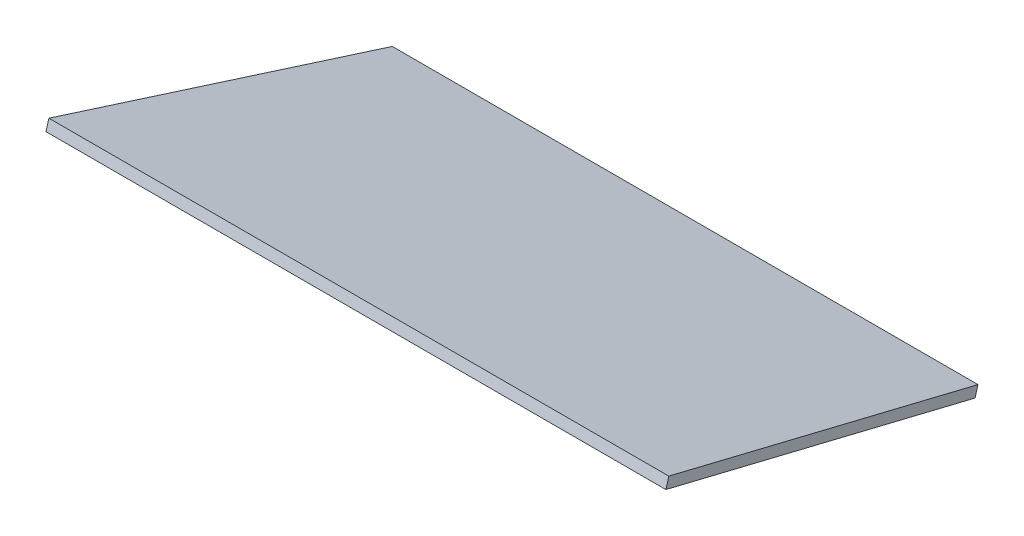
ISO-10303-21;
HEADER;
FILE_DESCRIPTION(('STEP AP214'),'2;1');
FILE_NAME('part.step','',(''),(''),'','','');
FILE_SCHEMA(('AUTOMOTIVE_DESIGN { 1 0 10303 214 1 1 1 1 }'));
ENDSEC;
DATA;
#1=APPLICATION_CONTEXT('core data for automotive mechanical design processes');
#2=APPLICATION_PROTOCOL_DEFINITION('international standard','automotive_design',2000,#1);
#3=PRODUCT_CONTEXT('',#1,'mechanical');
#4=PRODUCT('Part','Part','',(#3));
#5=PRODUCT_RELATED_PRODUCT_CATEGORY('part','',(#4));
#6=PRODUCT_DEFINITION_FORMATION('','',#4);
#7=PRODUCT_DEFINITION_CONTEXT('part definition',#1,'design');
#8=PRODUCT_DEFINITION('design','',#6,#7);
#9=PRODUCT_DEFINITION_SHAPE('','',#8);
#10=(LENGTH_UNIT() NAMED_UNIT(*) SI_UNIT(.MILLI.,.METRE.));
#11=(NAMED_UNIT(*) PLANE_ANGLE_UNIT() SI_UNIT($,.RADIAN.));
#12=(NAMED_UNIT(*) SI_UNIT($,.STERADIAN.) SOLID_ANGLE_UNIT());
#13=UNCERTAINTY_MEASURE_WITH_UNIT(LENGTH_MEASURE(1.E-05),#10,'distance_accuracy_value','');
#14=(GEOMETRIC_REPRESENTATION_CONTEXT(3) GLOBAL_UNCERTAINTY_ASSIGNED_CONTEXT((#13)) GLOBAL_UNIT_ASSIGNED_CONTEXT((#10,
#11,#12)) REPRESENTATION_CONTEXT('',''));
#15=CARTESIAN_POINT('',(0.,0.,0.));
#16=DIRECTION('',(0.,0.,1.));
#17=DIRECTION('',(1.,0.,0.));
#18=AXIS2_PLACEMENT_3D('',#15,#16,#17);
#19=CARTESIAN_POINT('',(-973.596176485732,862.556716449971,-601.47648078467));
#20=DIRECTION('',(0.,0.962139084786726,-0.272558950551549));
#21=DIRECTION('',(0.,0.272558950551549,0.962139084786726));
#22=AXIS2_PLACEMENT_3D('',#19,#20,#21);
#23=PLANE('',#22);
#24=DIRECTION('',(1.,0.,0.));
#25=VECTOR('',#24,1.);
#26=CARTESIAN_POINT('',(-973.596176485732,862.556716449971,-601.47648078467));
#27=LINE('',#26,#25);
#28=CARTESIAN_POINT('',(-440.977953351101,862.556716449971,-601.47648078467));
#29=VERTEX_POINT('',#28);
#30=CARTESIAN_POINT('',(440.977953351101,862.556716449971,-601.47648078467));
#31=VERTEX_POINT('',#30);
#32=EDGE_CURVE('E11',#29,#31,#27,.T.);
#33=ORIENTED_EDGE('',*,*,#32,.F.);
#34=DIRECTION('',(0.0503595928807039,-0.272213114321527,-0.960918275295181));
#35=VECTOR('',#34,1.);
#36=CARTESIAN_POINT('',(-442.328720352341,869.858135526198,-575.702311000741));
#37=LINE('',#36,#35);
#38=CARTESIAN_POINT('',(-466.729350119314,1001.75299488316,-110.110559150412));
#39=VERTEX_POINT('',#38);
#40=EDGE_CURVE('E90',#39,#29,#37,.T.);
#41=ORIENTED_EDGE('',*,*,#40,.F.);
#42=DIRECTION('',(1.,0.,0.));
#43=VECTOR('',#42,1.);
#44=CARTESIAN_POINT('',(-973.596176485732,1001.75299488316,-110.110559150412));
#45=LINE('',#44,#43);
#46=CARTESIAN_POINT('',(466.729350119314,1001.75299488316,-110.110559150412));
#47=VERTEX_POINT('',#46);
#48=EDGE_CURVE('E40',#39,#47,#45,.T.);
#49=ORIENTED_EDGE('',*,*,#48,.T.);
#50=DIRECTION('',(-0.0503595928807039,-0.272213114321527,-0.960918275295181));
#51=VECTOR('',#50,1.);
#52=CARTESIAN_POINT('',(442.328720352341,869.858135526198,-575.702311000741));
#53=LINE('',#52,#51);
#54=EDGE_CURVE('E89',#47,#31,#53,.T.);
#55=ORIENTED_EDGE('',*,*,#54,.T.);
#56=EDGE_LOOP('',(#33,#41,#49,#55));
#57=FACE_BOUND('',#56,.T.);
#58=ADVANCED_FACE('F37',(#57),#23,.T.);
#59=CARTESIAN_POINT('',(-973.596176485732,862.556716449971,-601.47648078467));
#60=DIRECTION('',(0.,0.272558950551546,0.962139084786727));
#61=DIRECTION('',(0.,-0.962139084786727,0.272558950551546));
#62=AXIS2_PLACEMENT_3D('',#59,#60,#61);
#63=PLANE('',#62);
#64=DIRECTION('',(0.,0.962139084786726,-0.272558950551549));
#65=VECTOR('',#64,1.);
#66=CARTESIAN_POINT('',(-440.977953351101,862.556716449971,-601.47648078467));
#67=LINE('',#66,#65);
#68=CARTESIAN_POINT('',(-440.977953351101,847.162491093384,-597.115537575845));
#69=VERTEX_POINT('',#68);
#70=EDGE_CURVE('E59',#29,#69,#67,.F.);
#71=ORIENTED_EDGE('',*,*,#70,.F.);
#72=ORIENTED_EDGE('',*,*,#32,.T.);
#73=DIRECTION('',(0.,0.962139084786726,-0.272558950551549));
#74=VECTOR('',#73,1.);
#75=CARTESIAN_POINT('',(440.977953351101,862.556716449971,-601.47648078467));
#76=LINE('',#75,#74);
#77=CARTESIAN_POINT('',(440.977953351101,847.162491093384,-597.115537575845));
#78=VERTEX_POINT('',#77);
#79=EDGE_CURVE('E96',#31,#78,#76,.F.);
#80=ORIENTED_EDGE('',*,*,#79,.T.);
#81=DIRECTION('',(1.,0.,0.));
#82=VECTOR('',#81,1.);
#83=CARTESIAN_POINT('',(-973.596176485732,847.162491093384,-597.115537575845));
#84=LINE('',#83,#82);
#85=EDGE_CURVE('E45',#69,#78,#84,.T.);
#86=ORIENTED_EDGE('',*,*,#85,.F.);
#87=EDGE_LOOP('',(#71,#72,#80,#86));
#88=FACE_BOUND('',#87,.T.);
#89=ADVANCED_FACE('F110',(#88),#63,.F.);
#90=CARTESIAN_POINT('',(-973.596176485732,847.162491093384,-597.115537575845));
#91=DIRECTION('',(0.,0.962139084786726,-0.272558950551549));
#92=DIRECTION('',(0.,0.272558950551549,0.962139084786726));
#93=AXIS2_PLACEMENT_3D('',#90,#91,#92);
#94=PLANE('',#93);
#95=DIRECTION('',(0.0503595928807039,-0.272213114321527,-0.960918275295181));
#96=VECTOR('',#95,1.);
#97=CARTESIAN_POINT('',(-442.328720352341,854.463910169611,-571.341367791916));
#98=LINE('',#97,#96);
#99=CARTESIAN_POINT('',(-466.729350119314,986.358769526574,-105.749615941587));
#100=VERTEX_POINT('',#99);
#101=EDGE_CURVE('E53',#100,#69,#98,.T.);
#102=ORIENTED_EDGE('',*,*,#101,.T.);
#103=ORIENTED_EDGE('',*,*,#85,.T.);
#104=DIRECTION('',(-0.0503595928807039,-0.272213114321527,-0.960918275295181));
#105=VECTOR('',#104,1.);
#106=CARTESIAN_POINT('',(442.328720352341,854.463910169611,-571.341367791916));
#107=LINE('',#106,#105);
#108=CARTESIAN_POINT('',(466.729350119314,986.358769526574,-105.749615941587));
#109=VERTEX_POINT('',#108);
#110=EDGE_CURVE('E97',#109,#78,#107,.T.);
#111=ORIENTED_EDGE('',*,*,#110,.F.);
#112=DIRECTION('',(1.,0.,0.));
#113=VECTOR('',#112,1.);
#114=CARTESIAN_POINT('',(-973.596176485732,986.358769526574,-105.749615941587));
#115=LINE('',#114,#113);
#116=EDGE_CURVE('E79',#100,#109,#115,.T.);
#117=ORIENTED_EDGE('',*,*,#116,.F.);
#118=EDGE_LOOP('',(#102,#103,#111,#117));
#119=FACE_BOUND('',#118,.T.);
#120=ADVANCED_FACE('F108',(#119),#94,.F.);
#121=CARTESIAN_POINT('',(-973.596176485732,986.358769526574,-105.749615941587));
#122=DIRECTION('',(0.,-0.272558950551554,-0.962139084786724));
#123=DIRECTION('',(0.,0.962139084786724,-0.272558950551554));
#124=AXIS2_PLACEMENT_3D('',#121,#122,#123);
#125=PLANE('',#124);
#126=DIRECTION('',(0.,0.962139084786726,-0.272558950551549));
#127=VECTOR('',#126,1.);
#128=CARTESIAN_POINT('',(-466.729350119314,1001.75299488316,-110.110559150412));
#129=LINE('',#128,#127);
#130=EDGE_CURVE('E65',#39,#100,#129,.F.);
#131=ORIENTED_EDGE('',*,*,#130,.T.);
#132=ORIENTED_EDGE('',*,*,#116,.T.);
#133=DIRECTION('',(0.,0.962139084786726,-0.272558950551549));
#134=VECTOR('',#133,1.);
#135=CARTESIAN_POINT('',(466.729350119314,1001.75299488316,-110.110559150412));
#136=LINE('',#135,#134);
#137=EDGE_CURVE('E94',#47,#109,#136,.F.);
#138=ORIENTED_EDGE('',*,*,#137,.F.);
#139=ORIENTED_EDGE('',*,*,#48,.F.);
#140=EDGE_LOOP('',(#131,#132,#138,#139));
#141=FACE_BOUND('',#140,.T.);
#142=ADVANCED_FACE('F99',(#141),#125,.F.);
#143=CARTESIAN_POINT('',(-442.328720352341,869.858135526198,-575.702311000741));
#144=DIRECTION('',(0.998731150713189,0.0137259577857679,0.0484529326044726));
#145=DIRECTION('',(0.0503595928807039,-0.272213114321527,-0.960918275295181));
#146=AXIS2_PLACEMENT_3D('',#143,#144,#145);
#147=PLANE('',#146);
#148=ORIENTED_EDGE('',*,*,#40,.T.);
#149=ORIENTED_EDGE('',*,*,#70,.T.);
#150=ORIENTED_EDGE('',*,*,#101,.F.);
#151=ORIENTED_EDGE('',*,*,#130,.F.);
#152=EDGE_LOOP('',(#148,#149,#150,#151));
#153=FACE_BOUND('',#152,.T.);
#154=ADVANCED_FACE('F119',(#153),#147,.F.);
#155=CARTESIAN_POINT('',(442.328720352341,869.858135526198,-575.702311000741));
#156=DIRECTION('',(-0.998731150713189,0.0137259577857679,0.0484529326044726));
#157=DIRECTION('',(-0.0503595928807039,-0.272213114321527,-0.960918275295181));
#158=AXIS2_PLACEMENT_3D('',#155,#156,#157);
#159=PLANE('',#158);
#160=ORIENTED_EDGE('',*,*,#79,.F.);
#161=ORIENTED_EDGE('',*,*,#54,.F.);
#162=ORIENTED_EDGE('',*,*,#137,.T.);
#163=ORIENTED_EDGE('',*,*,#110,.T.);
#164=EDGE_LOOP('',(#160,#161,#162,#163));
#165=FACE_BOUND('',#164,.T.);
#166=ADVANCED_FACE('F93',(#165),#159,.F.);
#167=CLOSED_SHELL('',(#58,#89,#120,#142,#154,#166));
#168=MANIFOLD_SOLID_BREP('B2',#167);
#169=ADVANCED_BREP_SHAPE_REPRESENTATION('',(#18,#168),#14);
#170=SHAPE_DEFINITION_REPRESENTATION(#9,#169);
ENDSEC;
END-ISO-10303-21;
